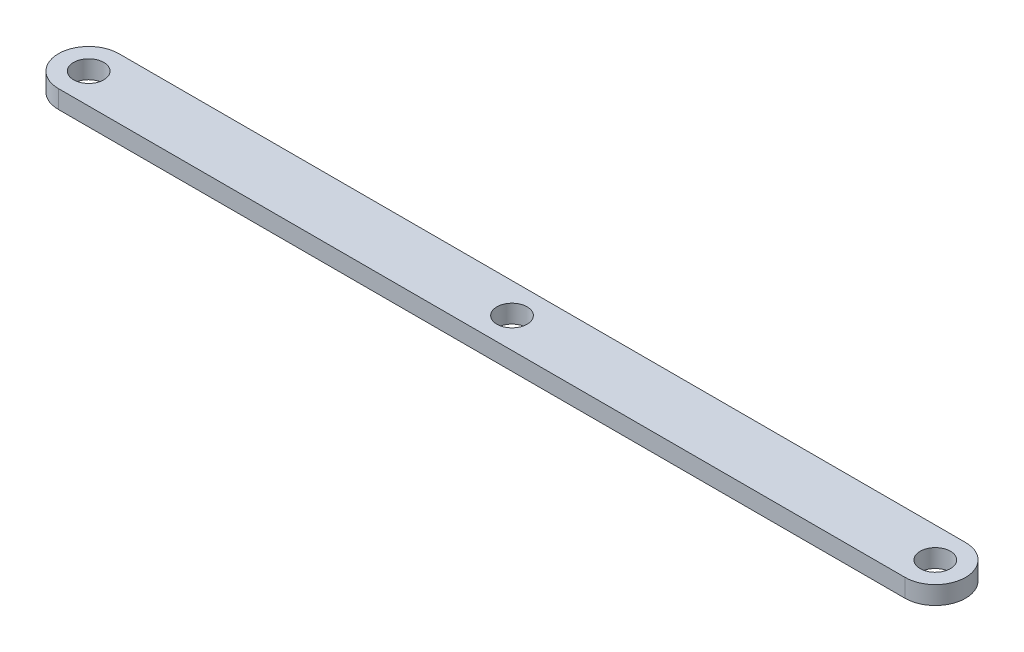
ISO-10303-21;
HEADER;
FILE_DESCRIPTION(('STEP AP214'),'2;1');
FILE_NAME('part.step','',(''),(''),'','','');
FILE_SCHEMA(('AUTOMOTIVE_DESIGN { 1 0 10303 214 1 1 1 1 }'));
ENDSEC;
DATA;
#1=APPLICATION_CONTEXT('core data for automotive mechanical design processes');
#2=APPLICATION_PROTOCOL_DEFINITION('international standard','automotive_design',2000,#1);
#3=PRODUCT_CONTEXT('',#1,'mechanical');
#4=PRODUCT('Part','Part','',(#3));
#5=PRODUCT_RELATED_PRODUCT_CATEGORY('part','',(#4));
#6=PRODUCT_DEFINITION_FORMATION('','',#4);
#7=PRODUCT_DEFINITION_CONTEXT('part definition',#1,'design');
#8=PRODUCT_DEFINITION('design','',#6,#7);
#9=PRODUCT_DEFINITION_SHAPE('','',#8);
#10=(LENGTH_UNIT() NAMED_UNIT(*) SI_UNIT(.MILLI.,.METRE.));
#11=(NAMED_UNIT(*) PLANE_ANGLE_UNIT() SI_UNIT($,.RADIAN.));
#12=(NAMED_UNIT(*) SI_UNIT($,.STERADIAN.) SOLID_ANGLE_UNIT());
#13=UNCERTAINTY_MEASURE_WITH_UNIT(LENGTH_MEASURE(1.E-05),#10,'distance_accuracy_value','');
#14=(GEOMETRIC_REPRESENTATION_CONTEXT(3) GLOBAL_UNCERTAINTY_ASSIGNED_CONTEXT((#13)) GLOBAL_UNIT_ASSIGNED_CONTEXT((#10,
#11,#12)) REPRESENTATION_CONTEXT('',''));
#15=CARTESIAN_POINT('',(0.,0.,0.));
#16=DIRECTION('',(0.,0.,1.));
#17=DIRECTION('',(1.,0.,0.));
#18=AXIS2_PLACEMENT_3D('',#15,#16,#17);
#19=CARTESIAN_POINT('',(0.,3.,0.));
#20=DIRECTION('',(0.,1.,0.));
#21=DIRECTION('',(0.,0.,1.));
#22=AXIS2_PLACEMENT_3D('',#19,#20,#21);
#23=PLANE('',#22);
#24=CARTESIAN_POINT('',(140.,3.,0.));
#25=DIRECTION('',(0.,1.,0.));
#26=DIRECTION('',(0.,0.,1.));
#27=AXIS2_PLACEMENT_3D('',#24,#25,#26);
#28=CIRCLE('',#27,2.5);
#29=CARTESIAN_POINT('',(140.,3.,2.5));
#30=VERTEX_POINT('',#29);
#31=EDGE_CURVE('E134',#30,#30,#28,.T.);
#32=ORIENTED_EDGE('',*,*,#31,.F.);
#33=EDGE_LOOP('',(#32));
#34=FACE_BOUND('',#33,.T.);
#35=CARTESIAN_POINT('',(0.,3.,0.));
#36=DIRECTION('',(0.,1.,0.));
#37=DIRECTION('',(0.,0.,1.));
#38=AXIS2_PLACEMENT_3D('',#35,#36,#37);
#39=CIRCLE('',#38,5.);
#40=CARTESIAN_POINT('',(0.,3.,-5.));
#41=VERTEX_POINT('',#40);
#42=CARTESIAN_POINT('',(0.,3.,5.));
#43=VERTEX_POINT('',#42);
#44=EDGE_CURVE('E92',#41,#43,#39,.T.);
#45=ORIENTED_EDGE('',*,*,#44,.T.);
#46=DIRECTION('',(1.,0.,0.));
#47=VECTOR('',#46,1.);
#48=CARTESIAN_POINT('',(0.,3.,5.));
#49=LINE('',#48,#47);
#50=CARTESIAN_POINT('',(140.,3.,5.));
#51=VERTEX_POINT('',#50);
#52=EDGE_CURVE('E87',#43,#51,#49,.T.);
#53=ORIENTED_EDGE('',*,*,#52,.T.);
#54=CARTESIAN_POINT('',(140.,3.,0.));
#55=DIRECTION('',(0.,1.,0.));
#56=DIRECTION('',(0.,0.,1.));
#57=AXIS2_PLACEMENT_3D('',#54,#55,#56);
#58=CIRCLE('',#57,5.);
#59=CARTESIAN_POINT('',(140.,3.,-5.));
#60=VERTEX_POINT('',#59);
#61=EDGE_CURVE('E90',#51,#60,#58,.T.);
#62=ORIENTED_EDGE('',*,*,#61,.T.);
#63=DIRECTION('',(-1.,0.,0.));
#64=VECTOR('',#63,1.);
#65=CARTESIAN_POINT('',(0.,3.,-5.));
#66=LINE('',#65,#64);
#67=EDGE_CURVE('E57',#60,#41,#66,.T.);
#68=ORIENTED_EDGE('',*,*,#67,.T.);
#69=EDGE_LOOP('',(#45,#53,#62,#68));
#70=FACE_BOUND('',#69,.T.);
#71=CARTESIAN_POINT('',(0.,3.,0.));
#72=DIRECTION('',(0.,1.,0.));
#73=DIRECTION('',(0.,0.,1.));
#74=AXIS2_PLACEMENT_3D('',#71,#72,#73);
#75=CIRCLE('',#74,2.5);
#76=CARTESIAN_POINT('',(0.,3.,2.5));
#77=VERTEX_POINT('',#76);
#78=EDGE_CURVE('E112',#77,#77,#75,.T.);
#79=ORIENTED_EDGE('',*,*,#78,.F.);
#80=EDGE_LOOP('',(#79));
#81=FACE_BOUND('',#80,.T.);
#82=CARTESIAN_POINT('',(70.,3.,0.));
#83=DIRECTION('',(0.,1.,0.));
#84=DIRECTION('',(0.,0.,1.));
#85=AXIS2_PLACEMENT_3D('',#82,#83,#84);
#86=CIRCLE('',#85,2.5);
#87=CARTESIAN_POINT('',(70.,3.,2.5));
#88=VERTEX_POINT('',#87);
#89=EDGE_CURVE('E142',#88,#88,#86,.T.);
#90=ORIENTED_EDGE('',*,*,#89,.F.);
#91=EDGE_LOOP('',(#90));
#92=FACE_BOUND('',#91,.T.);
#93=ADVANCED_FACE('F39',(#34,#70,#81,#92),#23,.T.);
#94=CARTESIAN_POINT('',(0.,0.,0.));
#95=DIRECTION('',(0.,1.,0.));
#96=DIRECTION('',(0.,0.,1.));
#97=AXIS2_PLACEMENT_3D('',#94,#95,#96);
#98=PLANE('',#97);
#99=CARTESIAN_POINT('',(0.,0.,0.));
#100=DIRECTION('',(0.,1.,0.));
#101=DIRECTION('',(0.,0.,1.));
#102=AXIS2_PLACEMENT_3D('',#99,#100,#101);
#103=CIRCLE('',#102,5.);
#104=CARTESIAN_POINT('',(0.,0.,-5.));
#105=VERTEX_POINT('',#104);
#106=CARTESIAN_POINT('',(0.,0.,5.));
#107=VERTEX_POINT('',#106);
#108=EDGE_CURVE('E108',#105,#107,#103,.T.);
#109=ORIENTED_EDGE('',*,*,#108,.F.);
#110=DIRECTION('',(-1.,0.,0.));
#111=VECTOR('',#110,1.);
#112=CARTESIAN_POINT('',(0.,0.,-5.));
#113=LINE('',#112,#111);
#114=CARTESIAN_POINT('',(140.,0.,-5.));
#115=VERTEX_POINT('',#114);
#116=EDGE_CURVE('E80',#115,#105,#113,.T.);
#117=ORIENTED_EDGE('',*,*,#116,.F.);
#118=CARTESIAN_POINT('',(140.,0.,0.));
#119=DIRECTION('',(0.,1.,0.));
#120=DIRECTION('',(0.,0.,1.));
#121=AXIS2_PLACEMENT_3D('',#118,#119,#120);
#122=CIRCLE('',#121,5.);
#123=CARTESIAN_POINT('',(140.,0.,5.));
#124=VERTEX_POINT('',#123);
#125=EDGE_CURVE('E74',#124,#115,#122,.T.);
#126=ORIENTED_EDGE('',*,*,#125,.F.);
#127=DIRECTION('',(1.,0.,0.));
#128=VECTOR('',#127,1.);
#129=CARTESIAN_POINT('',(0.,0.,5.));
#130=LINE('',#129,#128);
#131=EDGE_CURVE('E97',#107,#124,#130,.T.);
#132=ORIENTED_EDGE('',*,*,#131,.F.);
#133=EDGE_LOOP('',(#109,#117,#126,#132));
#134=FACE_BOUND('',#133,.T.);
#135=CARTESIAN_POINT('',(0.,0.,0.));
#136=DIRECTION('',(0.,1.,0.));
#137=DIRECTION('',(0.,0.,1.));
#138=AXIS2_PLACEMENT_3D('',#135,#136,#137);
#139=CIRCLE('',#138,2.5);
#140=CARTESIAN_POINT('',(0.,0.,2.5));
#141=VERTEX_POINT('',#140);
#142=EDGE_CURVE('E130',#141,#141,#139,.T.);
#143=ORIENTED_EDGE('',*,*,#142,.T.);
#144=EDGE_LOOP('',(#143));
#145=FACE_BOUND('',#144,.T.);
#146=CARTESIAN_POINT('',(140.,0.,0.));
#147=DIRECTION('',(0.,1.,0.));
#148=DIRECTION('',(0.,0.,1.));
#149=AXIS2_PLACEMENT_3D('',#146,#147,#148);
#150=CIRCLE('',#149,2.5);
#151=CARTESIAN_POINT('',(140.,0.,2.5));
#152=VERTEX_POINT('',#151);
#153=EDGE_CURVE('E138',#152,#152,#150,.T.);
#154=ORIENTED_EDGE('',*,*,#153,.T.);
#155=EDGE_LOOP('',(#154));
#156=FACE_BOUND('',#155,.T.);
#157=CARTESIAN_POINT('',(70.,0.,0.));
#158=DIRECTION('',(0.,1.,0.));
#159=DIRECTION('',(0.,0.,1.));
#160=AXIS2_PLACEMENT_3D('',#157,#158,#159);
#161=CIRCLE('',#160,2.5);
#162=CARTESIAN_POINT('',(70.,0.,2.5));
#163=VERTEX_POINT('',#162);
#164=EDGE_CURVE('E146',#163,#163,#161,.T.);
#165=ORIENTED_EDGE('',*,*,#164,.T.);
#166=EDGE_LOOP('',(#165));
#167=FACE_BOUND('',#166,.T.);
#168=ADVANCED_FACE('F125',(#134,#145,#156,#167),#98,.F.);
#169=CARTESIAN_POINT('',(0.,3.,0.));
#170=DIRECTION('',(0.,-1.,0.));
#171=DIRECTION('',(0.,0.,-1.));
#172=AXIS2_PLACEMENT_3D('',#169,#170,#171);
#173=CYLINDRICAL_SURFACE('',#172,5.);
#174=ORIENTED_EDGE('',*,*,#108,.T.);
#175=DIRECTION('',(0.,-1.,0.));
#176=VECTOR('',#175,1.);
#177=CARTESIAN_POINT('',(0.,3.,5.));
#178=LINE('',#177,#176);
#179=EDGE_CURVE('E11',#43,#107,#178,.T.);
#180=ORIENTED_EDGE('',*,*,#179,.F.);
#181=ORIENTED_EDGE('',*,*,#44,.F.);
#182=DIRECTION('',(0.,-1.,0.));
#183=VECTOR('',#182,1.);
#184=CARTESIAN_POINT('',(0.,3.,-5.));
#185=LINE('',#184,#183);
#186=EDGE_CURVE('E104',#41,#105,#185,.T.);
#187=ORIENTED_EDGE('',*,*,#186,.T.);
#188=EDGE_LOOP('',(#174,#180,#181,#187));
#189=FACE_BOUND('',#188,.T.);
#190=ADVANCED_FACE('F41',(#189),#173,.T.);
#191=CARTESIAN_POINT('',(0.,3.,5.));
#192=DIRECTION('',(0.,0.,-1.));
#193=DIRECTION('',(-1.,0.,0.));
#194=AXIS2_PLACEMENT_3D('',#191,#192,#193);
#195=PLANE('',#194);
#196=ORIENTED_EDGE('',*,*,#131,.T.);
#197=DIRECTION('',(0.,-1.,0.));
#198=VECTOR('',#197,1.);
#199=CARTESIAN_POINT('',(140.,3.,5.));
#200=LINE('',#199,#198);
#201=EDGE_CURVE('E49',#51,#124,#200,.T.);
#202=ORIENTED_EDGE('',*,*,#201,.F.);
#203=ORIENTED_EDGE('',*,*,#52,.F.);
#204=ORIENTED_EDGE('',*,*,#179,.T.);
#205=EDGE_LOOP('',(#196,#202,#203,#204));
#206=FACE_BOUND('',#205,.T.);
#207=ADVANCED_FACE('F96',(#206),#195,.F.);
#208=CARTESIAN_POINT('',(140.,3.,0.));
#209=DIRECTION('',(0.,-1.,0.));
#210=DIRECTION('',(0.,0.,-1.));
#211=AXIS2_PLACEMENT_3D('',#208,#209,#210);
#212=CYLINDRICAL_SURFACE('',#211,5.);
#213=ORIENTED_EDGE('',*,*,#125,.T.);
#214=DIRECTION('',(0.,-1.,0.));
#215=VECTOR('',#214,1.);
#216=CARTESIAN_POINT('',(140.,3.,-5.));
#217=LINE('',#216,#215);
#218=EDGE_CURVE('E99',#60,#115,#217,.T.);
#219=ORIENTED_EDGE('',*,*,#218,.F.);
#220=ORIENTED_EDGE('',*,*,#61,.F.);
#221=ORIENTED_EDGE('',*,*,#201,.T.);
#222=EDGE_LOOP('',(#213,#219,#220,#221));
#223=FACE_BOUND('',#222,.T.);
#224=ADVANCED_FACE('F100',(#223),#212,.T.);
#225=CARTESIAN_POINT('',(0.,3.,-5.));
#226=DIRECTION('',(0.,0.,1.));
#227=DIRECTION('',(1.,0.,0.));
#228=AXIS2_PLACEMENT_3D('',#225,#226,#227);
#229=PLANE('',#228);
#230=ORIENTED_EDGE('',*,*,#116,.T.);
#231=ORIENTED_EDGE('',*,*,#186,.F.);
#232=ORIENTED_EDGE('',*,*,#67,.F.);
#233=ORIENTED_EDGE('',*,*,#218,.T.);
#234=EDGE_LOOP('',(#230,#231,#232,#233));
#235=FACE_BOUND('',#234,.T.);
#236=ADVANCED_FACE('F122',(#235),#229,.F.);
#237=CARTESIAN_POINT('',(0.,3.,0.));
#238=DIRECTION('',(0.,-1.,0.));
#239=DIRECTION('',(0.,0.,-1.));
#240=AXIS2_PLACEMENT_3D('',#237,#238,#239);
#241=CYLINDRICAL_SURFACE('',#240,2.5);
#242=ORIENTED_EDGE('',*,*,#78,.T.);
#243=EDGE_LOOP('',(#242));
#244=FACE_BOUND('',#243,.T.);
#245=ORIENTED_EDGE('',*,*,#142,.F.);
#246=EDGE_LOOP('',(#245));
#247=FACE_BOUND('',#246,.T.);
#248=ADVANCED_FACE('F166',(#244,#247),#241,.F.);
#249=CARTESIAN_POINT('',(140.,3.,0.));
#250=DIRECTION('',(0.,-1.,0.));
#251=DIRECTION('',(0.,0.,-1.));
#252=AXIS2_PLACEMENT_3D('',#249,#250,#251);
#253=CYLINDRICAL_SURFACE('',#252,2.5);
#254=ORIENTED_EDGE('',*,*,#31,.T.);
#255=EDGE_LOOP('',(#254));
#256=FACE_BOUND('',#255,.T.);
#257=ORIENTED_EDGE('',*,*,#153,.F.);
#258=EDGE_LOOP('',(#257));
#259=FACE_BOUND('',#258,.T.);
#260=ADVANCED_FACE('F212',(#256,#259),#253,.F.);
#261=CARTESIAN_POINT('',(70.,3.,0.));
#262=DIRECTION('',(0.,-1.,0.));
#263=DIRECTION('',(0.,0.,-1.));
#264=AXIS2_PLACEMENT_3D('',#261,#262,#263);
#265=CYLINDRICAL_SURFACE('',#264,2.5);
#266=ORIENTED_EDGE('',*,*,#89,.T.);
#267=EDGE_LOOP('',(#266));
#268=FACE_BOUND('',#267,.T.);
#269=ORIENTED_EDGE('',*,*,#164,.F.);
#270=EDGE_LOOP('',(#269));
#271=FACE_BOUND('',#270,.T.);
#272=ADVANCED_FACE('F154',(#268,#271),#265,.F.);
#273=CLOSED_SHELL('',(#93,#168,#190,#207,#224,#236,#248,#260,#272));
#274=MANIFOLD_SOLID_BREP('B2',#273);
#275=ADVANCED_BREP_SHAPE_REPRESENTATION('',(#18,#274),#14);
#276=SHAPE_DEFINITION_REPRESENTATION(#9,#275);
ENDSEC;
END-ISO-10303-21;
